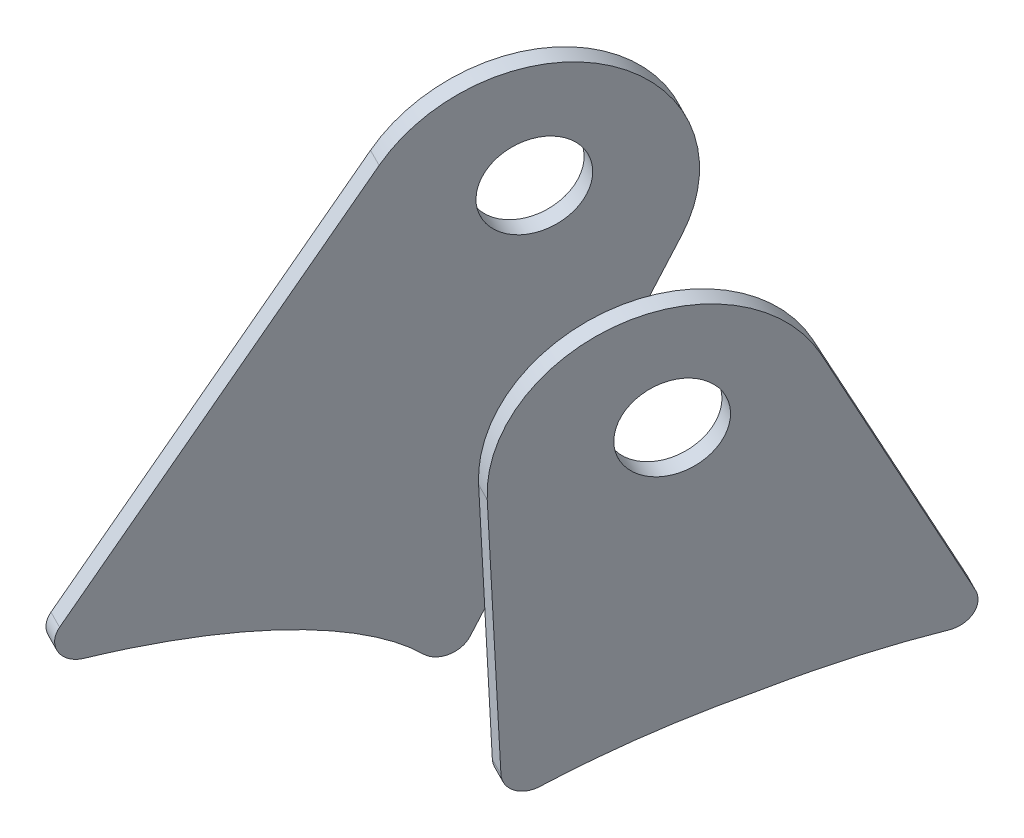
ISO-10303-21;
HEADER;
FILE_DESCRIPTION(('STEP AP214'),'2;1');
FILE_NAME('part.step','',(''),(''),'','','');
FILE_SCHEMA(('AUTOMOTIVE_DESIGN { 1 0 10303 214 1 1 1 1 }'));
ENDSEC;
DATA;
#1=APPLICATION_CONTEXT('core data for automotive mechanical design processes');
#2=APPLICATION_PROTOCOL_DEFINITION('international standard','automotive_design',2000,#1);
#3=PRODUCT_CONTEXT('',#1,'mechanical');
#4=PRODUCT('Part','Part','',(#3));
#5=PRODUCT_RELATED_PRODUCT_CATEGORY('part','',(#4));
#6=PRODUCT_DEFINITION_FORMATION('','',#4);
#7=PRODUCT_DEFINITION_CONTEXT('part definition',#1,'design');
#8=PRODUCT_DEFINITION('design','',#6,#7);
#9=PRODUCT_DEFINITION_SHAPE('','',#8);
#10=(LENGTH_UNIT() NAMED_UNIT(*) SI_UNIT(.MILLI.,.METRE.));
#11=(NAMED_UNIT(*) PLANE_ANGLE_UNIT() SI_UNIT($,.RADIAN.));
#12=(NAMED_UNIT(*) SI_UNIT($,.STERADIAN.) SOLID_ANGLE_UNIT());
#13=UNCERTAINTY_MEASURE_WITH_UNIT(LENGTH_MEASURE(1.E-05),#10,'distance_accuracy_value','');
#14=(GEOMETRIC_REPRESENTATION_CONTEXT(3) GLOBAL_UNCERTAINTY_ASSIGNED_CONTEXT((#13)) GLOBAL_UNIT_ASSIGNED_CONTEXT((#10,
#11,#12)) REPRESENTATION_CONTEXT('',''));
#15=CARTESIAN_POINT('',(0.,0.,0.));
#16=DIRECTION('',(0.,0.,1.));
#17=DIRECTION('',(1.,0.,0.));
#18=AXIS2_PLACEMENT_3D('',#15,#16,#17);
#19=CARTESIAN_POINT('',(1315.91198853962,177.013000299117,496.611994585862));
#20=DIRECTION('',(-0.31307025087173,0.530600499071286,0.787686567363196));
#21=DIRECTION('',(0.,0.829379498727392,-0.558685642459782));
#22=AXIS2_PLACEMENT_3D('',#19,#20,#21);
#23=PLANE('',#22);
#24=DIRECTION('',(0.286551754259209,0.843500847863434,-0.454306517435792));
#25=VECTOR('',#24,1.);
#26=CARTESIAN_POINT('',(1317.06193487105,176.906976746498,497.140466383718));
#27=LINE('',#26,#25);
#28=CARTESIAN_POINT('',(1322.78996053934,193.768135109614,488.059107241894));
#29=VERTEX_POINT('',#28);
#30=CARTESIAN_POINT('',(1331.70769155631,220.01858921439,473.920707244246));
#31=VERTEX_POINT('',#30);
#32=EDGE_CURVE('E114',#29,#31,#27,.T.);
#33=ORIENTED_EDGE('',*,*,#32,.T.);
#34=DIRECTION('',(0.905469552304262,-0.0834831122980549,0.416119525870812));
#35=VECTOR('',#34,1.);
#36=CARTESIAN_POINT('',(1330.55774522488,220.124612767009,473.39223544639));
#37=LINE('',#36,#35);
#38=CARTESIAN_POINT('',(1330.55774522488,220.124612767009,473.39223544639));
#39=VERTEX_POINT('',#38);
#40=EDGE_CURVE('E122',#39,#31,#37,.T.);
#41=ORIENTED_EDGE('',*,*,#40,.F.);
#42=DIRECTION('',(0.286551754259209,0.843500847863434,-0.454306517435792));
#43=VECTOR('',#42,1.);
#44=CARTESIAN_POINT('',(1315.91198853962,177.013000299117,496.611994585862));
#45=LINE('',#44,#43);
#46=CARTESIAN_POINT('',(1321.64001420792,193.874158662233,487.530635444039));
#47=VERTEX_POINT('',#46);
#48=EDGE_CURVE('E110',#47,#39,#45,.T.);
#49=ORIENTED_EDGE('',*,*,#48,.F.);
#50=DIRECTION('',(-0.905469552304262,0.083483112298055,-0.416119525870812));
#51=VECTOR('',#50,1.);
#52=CARTESIAN_POINT('',(1321.64001420792,193.874158662233,487.530635444039));
#53=LINE('',#52,#51);
#54=EDGE_CURVE('E136',#29,#47,#53,.T.);
#55=ORIENTED_EDGE('',*,*,#54,.F.);
#56=EDGE_LOOP('',(#33,#41,#49,#55));
#57=FACE_BOUND('',#56,.T.);
#58=ADVANCED_FACE('F49',(#57),#23,.T.);
#59=CARTESIAN_POINT('',(1329.38625114849,183.005525752072,468.49444871424));
#60=DIRECTION('',(0.349198147405529,-0.410707466315973,-0.842247013031723));
#61=DIRECTION('',(0.,-0.898829300013332,0.438298858585719));
#62=AXIS2_PLACEMENT_3D('',#59,#60,#61);
#63=PLANE('',#62);
#64=DIRECTION('',(-0.241216798126639,-0.907937193352791,0.342730957499012));
#65=VECTOR('',#64,1.);
#66=CARTESIAN_POINT('',(1329.38625114849,183.005525752072,468.49444871424));
#67=LINE('',#66,#65);
#68=CARTESIAN_POINT('',(1336.86585171847,211.158654396695,457.867118093128));
#69=VERTEX_POINT('',#68);
#70=CARTESIAN_POINT('',(1330.55591561826,187.408129070302,466.832540311553));
#71=VERTEX_POINT('',#70);
#72=EDGE_CURVE('E108',#69,#71,#67,.T.);
#73=ORIENTED_EDGE('',*,*,#72,.F.);
#74=DIRECTION('',(0.905469552304262,-0.0834831122980549,0.416119525870812));
#75=VECTOR('',#74,1.);
#76=CARTESIAN_POINT('',(1336.86585171847,211.158654396695,457.867118093128));
#77=LINE('',#76,#75);
#78=CARTESIAN_POINT('',(1338.0157980499,211.052630844077,458.395589890984));
#79=VERTEX_POINT('',#78);
#80=EDGE_CURVE('E117',#69,#79,#77,.T.);
#81=ORIENTED_EDGE('',*,*,#80,.T.);
#82=DIRECTION('',(-0.241216798126639,-0.907937193352791,0.342730957499012));
#83=VECTOR('',#82,1.);
#84=CARTESIAN_POINT('',(1330.53619747992,182.899502199454,469.022920512096));
#85=LINE('',#84,#83);
#86=CARTESIAN_POINT('',(1331.70586194969,187.302105517683,467.361012109409));
#87=VERTEX_POINT('',#86);
#88=EDGE_CURVE('E131',#79,#87,#85,.T.);
#89=ORIENTED_EDGE('',*,*,#88,.T.);
#90=DIRECTION('',(-0.905469552304262,0.083483112298055,-0.416119525870812));
#91=VECTOR('',#90,1.);
#92=CARTESIAN_POINT('',(1330.55591561826,187.408129070302,466.832540311553));
#93=LINE('',#92,#91);
#94=EDGE_CURVE('E12',#71,#87,#93,.F.);
#95=ORIENTED_EDGE('',*,*,#94,.F.);
#96=EDGE_LOOP('',(#73,#81,#89,#95));
#97=FACE_BOUND('',#96,.T.);
#98=ADVANCED_FACE('F125',(#97),#63,.T.);
#99=CARTESIAN_POINT('',(1333.53973936443,215.070643013355,465.889520892256));
#100=DIRECTION('',(-0.905469552304262,0.083483112298055,-0.416119525870812));
#101=DIRECTION('',(0.417577207681798,0.,-0.908641445029156));
#102=AXIS2_PLACEMENT_3D('',#99,#100,#101);
#103=PLANE('',#102);
#104=CARTESIAN_POINT('',(1333.86054144698,216.573994912941,465.493067439949));
#105=DIRECTION('',(-0.905469552304262,0.083483112298055,-0.416119525870812));
#106=DIRECTION('',(-0.417577207681798,0.,0.908641445029156));
#107=AXIS2_PLACEMENT_3D('',#104,#105,#106);
#108=CIRCLE('',#107,3.1750000000001);
#109=CARTESIAN_POINT('',(1332.53473381259,216.573994912941,468.378004027917));
#110=VERTEX_POINT('',#109);
#111=EDGE_CURVE('E132',#110,#110,#108,.T.);
#112=ORIENTED_EDGE('',*,*,#111,.F.);
#113=EDGE_LOOP('',(#112));
#114=FACE_BOUND('',#113,.T.);
#115=ORIENTED_EDGE('',*,*,#48,.T.);
#116=CARTESIAN_POINT('',(1333.53973936443,215.070643013355,465.889520892256));
#117=DIRECTION('',(-0.905469552304262,0.083483112298055,-0.416119525870812));
#118=DIRECTION('',(0.417577207681798,0.,-0.908641445029156));
#119=AXIS2_PLACEMENT_3D('',#116,#117,#118);
#120=CIRCLE('',#119,9.52500000000001);
#121=EDGE_CURVE('E103',#39,#69,#120,.T.);
#122=ORIENTED_EDGE('',*,*,#121,.T.);
#123=ORIENTED_EDGE('',*,*,#72,.T.);
#124=CARTESIAN_POINT('',(1330.00156355926,188.060127173078,468.169607444741));
#125=DIRECTION('',(0.905469552304262,-0.083483112298055,0.416119525870812));
#126=DIRECTION('',(0.417577207681798,0.,-0.908641445029156));
#127=AXIS2_PLACEMENT_3D('',#124,#125,#126);
#128=CIRCLE('',#127,1.5875);
#129=CARTESIAN_POINT('',(1329.46211870526,186.901216929926,469.110927022683));
#130=VERTEX_POINT('',#129);
#131=EDGE_CURVE('E140',#130,#71,#128,.T.);
#132=ORIENTED_EDGE('',*,*,#131,.F.);
#133=CARTESIAN_POINT('',(1317.99053268235,177.937409229088,492.274572793221));
#134=DIRECTION('',(0.905469552304262,-0.083483112298055,0.416119525870812));
#135=DIRECTION('',(-0.424386223901574,-0.188740959148202,0.885591995956591));
#136=AXIS2_PLACEMENT_3D('',#133,#134,#135);
#137=ELLIPSE('',#136,28.4779023788006,12.7);
#138=CARTESIAN_POINT('',(1322.03720766495,191.450632950807,486.18013392729));
#139=VERTEX_POINT('',#138);
#140=EDGE_CURVE('E194',#130,#139,#137,.T.);
#141=ORIENTED_EDGE('',*,*,#140,.T.);
#142=CARTESIAN_POINT('',(1322.13701323118,193.031830369957,486.280183018349));
#143=DIRECTION('',(0.905469552304262,-0.083483112298055,0.416119525870812));
#144=DIRECTION('',(0.417577207681798,0.,-0.908641445029156));
#145=AXIS2_PLACEMENT_3D('',#142,#143,#144);
#146=CIRCLE('',#145,1.5875);
#147=EDGE_CURVE('E142',#47,#139,#146,.T.);
#148=ORIENTED_EDGE('',*,*,#147,.F.);
#149=EDGE_LOOP('',(#115,#122,#123,#132,#141,#148));
#150=FACE_BOUND('',#149,.T.);
#151=ADVANCED_FACE('F105',(#114,#150),#103,.T.);
#152=CARTESIAN_POINT('',(1334.68968569586,214.964619460736,466.417992690112));
#153=DIRECTION('',(-0.905469552304262,0.083483112298055,-0.416119525870812));
#154=DIRECTION('',(0.417577207681798,0.,-0.908641445029156));
#155=AXIS2_PLACEMENT_3D('',#152,#153,#154);
#156=PLANE('',#155);
#157=CARTESIAN_POINT('',(1335.0104877784,216.467971360322,466.021539237805));
#158=DIRECTION('',(-0.905469552304262,0.083483112298055,-0.416119525870812));
#159=DIRECTION('',(-0.417577207681798,0.,0.908641445029156));
#160=AXIS2_PLACEMENT_3D('',#157,#158,#159);
#161=CIRCLE('',#160,3.1750000000001);
#162=CARTESIAN_POINT('',(1333.68468014401,216.467971360322,468.906475825773));
#163=VERTEX_POINT('',#162);
#164=EDGE_CURVE('E193',#163,#163,#161,.T.);
#165=ORIENTED_EDGE('',*,*,#164,.T.);
#166=EDGE_LOOP('',(#165));
#167=FACE_BOUND('',#166,.T.);
#168=CARTESIAN_POINT('',(1319.14047901378,177.83138567647,492.803044591077));
#169=DIRECTION('',(0.905469552304262,-0.083483112298055,0.416119525870812));
#170=DIRECTION('',(-0.424386223901574,-0.188740959148202,0.885591995956591));
#171=AXIS2_PLACEMENT_3D('',#168,#169,#170);
#172=ELLIPSE('',#171,28.4779023788006,12.7);
#173=CARTESIAN_POINT('',(1330.61206503669,186.795193377308,469.639398820539));
#174=VERTEX_POINT('',#173);
#175=CARTESIAN_POINT('',(1323.18715399637,191.344609398188,486.708605725146));
#176=VERTEX_POINT('',#175);
#177=EDGE_CURVE('E153',#174,#176,#172,.T.);
#178=ORIENTED_EDGE('',*,*,#177,.F.);
#179=CARTESIAN_POINT('',(1331.15150989068,187.95410362046,468.698079242597));
#180=DIRECTION('',(0.905469552304262,-0.083483112298055,0.416119525870812));
#181=DIRECTION('',(0.417577207681798,0.,-0.908641445029156));
#182=AXIS2_PLACEMENT_3D('',#179,#180,#181);
#183=CIRCLE('',#182,1.5875);
#184=EDGE_CURVE('E64',#87,#174,#183,.F.);
#185=ORIENTED_EDGE('',*,*,#184,.F.);
#186=ORIENTED_EDGE('',*,*,#88,.F.);
#187=CARTESIAN_POINT('',(1334.68968569586,214.964619460736,466.417992690112));
#188=DIRECTION('',(-0.905469552304262,0.083483112298055,-0.416119525870812));
#189=DIRECTION('',(0.417577207681798,0.,-0.908641445029156));
#190=AXIS2_PLACEMENT_3D('',#187,#188,#189);
#191=CIRCLE('',#190,9.52500000000001);
#192=EDGE_CURVE('E119',#31,#79,#191,.T.);
#193=ORIENTED_EDGE('',*,*,#192,.F.);
#194=ORIENTED_EDGE('',*,*,#32,.F.);
#195=CARTESIAN_POINT('',(1323.2869595626,192.925806817338,486.808654816205));
#196=DIRECTION('',(0.905469552304262,-0.083483112298055,0.416119525870812));
#197=DIRECTION('',(0.417577207681798,0.,-0.908641445029156));
#198=AXIS2_PLACEMENT_3D('',#195,#196,#197);
#199=CIRCLE('',#198,1.5875);
#200=EDGE_CURVE('E57',#176,#29,#199,.F.);
#201=ORIENTED_EDGE('',*,*,#200,.F.);
#202=EDGE_LOOP('',(#178,#185,#186,#193,#194,#201));
#203=FACE_BOUND('',#202,.T.);
#204=ADVANCED_FACE('F152',(#167,#203),#156,.F.);
#205=CARTESIAN_POINT('',(1333.53973936443,215.070643013355,465.889520892256));
#206=DIRECTION('',(0.905469552304262,-0.0834831122980549,0.416119525870812));
#207=DIRECTION('',(-0.417577207681798,0.,0.908641445029156));
#208=AXIS2_PLACEMENT_3D('',#205,#206,#207);
#209=CYLINDRICAL_SURFACE('',#208,9.52500000000001);
#210=ORIENTED_EDGE('',*,*,#192,.T.);
#211=ORIENTED_EDGE('',*,*,#80,.F.);
#212=ORIENTED_EDGE('',*,*,#121,.F.);
#213=ORIENTED_EDGE('',*,*,#40,.T.);
#214=EDGE_LOOP('',(#210,#211,#212,#213));
#215=FACE_BOUND('',#214,.T.);
#216=ADVANCED_FACE('F118',(#215),#209,.T.);
#217=CARTESIAN_POINT('',(1333.86054144698,216.573994912941,465.493067439949));
#218=DIRECTION('',(0.905469552304262,-0.0834831122980549,0.416119525870812));
#219=DIRECTION('',(-0.417577207681798,0.,0.908641445029156));
#220=AXIS2_PLACEMENT_3D('',#217,#218,#219);
#221=CYLINDRICAL_SURFACE('',#220,3.1750000000001);
#222=ORIENTED_EDGE('',*,*,#111,.T.);
#223=EDGE_LOOP('',(#222));
#224=FACE_BOUND('',#223,.T.);
#225=ORIENTED_EDGE('',*,*,#164,.F.);
#226=EDGE_LOOP('',(#225));
#227=FACE_BOUND('',#226,.T.);
#228=ADVANCED_FACE('F161',(#224,#227),#221,.F.);
#229=CARTESIAN_POINT('',(1319.14047901378,177.83138567647,492.803044591077));
#230=DIRECTION('',(0.905469552304262,-0.083483112298055,0.416119525870812));
#231=DIRECTION('',(-0.424386223901574,-0.188740959148202,0.885591995956591));
#232=AXIS2_PLACEMENT_3D('',#229,#230,#231);
#233=ELLIPSE('',#232,28.4779023788006,12.7);
#234=DIRECTION('',(-0.905469552304262,0.083483112298055,-0.416119525870812));
#235=VECTOR('',#234,1.);
#236=SURFACE_OF_LINEAR_EXTRUSION('',#233,#235);
#237=ORIENTED_EDGE('',*,*,#140,.F.);
#238=DIRECTION('',(-0.905469552304262,0.083483112298055,-0.416119525870812));
#239=VECTOR('',#238,1.);
#240=CARTESIAN_POINT('',(1330.61206503669,186.795193377308,469.639398820539));
#241=LINE('',#240,#239);
#242=EDGE_CURVE('E144',#174,#130,#241,.T.);
#243=ORIENTED_EDGE('',*,*,#242,.F.);
#244=ORIENTED_EDGE('',*,*,#177,.T.);
#245=DIRECTION('',(-0.905469552304262,0.083483112298055,-0.416119525870812));
#246=VECTOR('',#245,1.);
#247=CARTESIAN_POINT('',(1322.03720766495,191.450632950807,486.18013392729));
#248=LINE('',#247,#246);
#249=EDGE_CURVE('E71',#139,#176,#248,.F.);
#250=ORIENTED_EDGE('',*,*,#249,.F.);
#251=EDGE_LOOP('',(#237,#243,#244,#250));
#252=FACE_BOUND('',#251,.T.);
#253=ADVANCED_FACE('F173',(#252),#236,.T.);
#254=CARTESIAN_POINT('',(1322.71198639689,192.978818593648,486.544418917277));
#255=DIRECTION('',(-0.905469552304262,0.083483112298055,-0.416119525870812));
#256=DIRECTION('',(0.417577207681798,0.,-0.908641445029156));
#257=AXIS2_PLACEMENT_3D('',#254,#255,#256);
#258=CYLINDRICAL_SURFACE('',#257,1.5875);
#259=ORIENTED_EDGE('',*,*,#200,.T.);
#260=ORIENTED_EDGE('',*,*,#54,.T.);
#261=ORIENTED_EDGE('',*,*,#147,.T.);
#262=ORIENTED_EDGE('',*,*,#249,.T.);
#263=EDGE_LOOP('',(#259,#260,#261,#262));
#264=FACE_BOUND('',#263,.T.);
#265=ADVANCED_FACE('F148',(#264),#258,.T.);
#266=CARTESIAN_POINT('',(1330.57653672497,188.007115396769,468.433843343669));
#267=DIRECTION('',(-0.905469552304262,0.083483112298055,-0.416119525870812));
#268=DIRECTION('',(0.417577207681798,0.,-0.908641445029156));
#269=AXIS2_PLACEMENT_3D('',#266,#267,#268);
#270=CYLINDRICAL_SURFACE('',#269,1.5875);
#271=ORIENTED_EDGE('',*,*,#184,.T.);
#272=ORIENTED_EDGE('',*,*,#242,.T.);
#273=ORIENTED_EDGE('',*,*,#131,.T.);
#274=ORIENTED_EDGE('',*,*,#94,.T.);
#275=EDGE_LOOP('',(#271,#272,#273,#274));
#276=FACE_BOUND('',#275,.T.);
#277=ADVANCED_FACE('F51',(#276),#270,.T.);
#278=CLOSED_SHELL('',(#58,#98,#151,#204,#216,#228,#253,#265,#277));
#279=MANIFOLD_SOLID_BREP('B2',#278);
#280=CARTESIAN_POINT('',(1349.07018245253,212.595197620884,483.483020617896));
#281=DIRECTION('',(0.421904939227984,0.0706608921737899,-0.90388232672856));
#282=DIRECTION('',(0.906147337010236,0.,0.422962177539857));
#283=AXIS2_PLACEMENT_3D('',#280,#281,#282);
#284=PLANE('',#283);
#285=DIRECTION('',(0.0460555328375425,0.994000808992746,0.0992032238226956));
#286=VECTOR('',#285,1.);
#287=CARTESIAN_POINT('',(1349.07018245253,212.595197620884,483.483020617896));
#288=LINE('',#287,#286);
#289=CARTESIAN_POINT('',(1348.21184254041,194.069940947574,481.634163788496));
#290=VERTEX_POINT('',#289);
#291=CARTESIAN_POINT('',(1349.07018245253,212.595197620884,483.483020617896));
#292=VERTEX_POINT('',#291);
#293=EDGE_CURVE('E395',#290,#292,#288,.T.);
#294=ORIENTED_EDGE('',*,*,#293,.T.);
#295=DIRECTION('',(-0.905469552304262,0.0834831122980549,-0.416119525870812));
#296=VECTOR('',#295,1.);
#297=CARTESIAN_POINT('',(1349.07018245253,212.595197620884,483.483020617896));
#298=LINE('',#297,#296);
#299=CARTESIAN_POINT('',(1347.92023612111,212.701221173503,482.95454882004));
#300=VERTEX_POINT('',#299);
#301=EDGE_CURVE('E403',#292,#300,#298,.T.);
#302=ORIENTED_EDGE('',*,*,#301,.T.);
#303=DIRECTION('',(0.0460555328375425,0.994000808992746,0.0992032238226956));
#304=VECTOR('',#303,1.);
#305=CARTESIAN_POINT('',(1347.92023612111,212.701221173503,482.95454882004));
#306=LINE('',#305,#304);
#307=CARTESIAN_POINT('',(1347.06189620898,194.175964500192,481.10569199064));
#308=VERTEX_POINT('',#307);
#309=EDGE_CURVE('E414',#308,#300,#306,.T.);
#310=ORIENTED_EDGE('',*,*,#309,.F.);
#311=DIRECTION('',(0.905469552304262,-0.0834831122980549,0.416119525870812));
#312=VECTOR('',#311,1.);
#313=CARTESIAN_POINT('',(1347.06189620898,194.175964500192,481.10569199064));
#314=LINE('',#313,#312);
#315=EDGE_CURVE('E47',#290,#308,#314,.F.);
#316=ORIENTED_EDGE('',*,*,#315,.F.);
#317=EDGE_LOOP('',(#294,#302,#310,#316));
#318=FACE_BOUND('',#317,.T.);
#319=ADVANCED_FACE('F262',(#318),#284,.F.);
#320=CARTESIAN_POINT('',(1361.06217513073,186.596398265217,452.172677993332));
#321=DIRECTION('',(-0.407647260300071,-0.443914751090842,0.797974564089484));
#322=DIRECTION('',(0.,0.873880257042931,0.486141230868748));
#323=AXIS2_PLACEMENT_3D('',#320,#321,#322);
#324=PLANE('',#323);
#325=DIRECTION('',(0.118104195606108,-0.892171655974895,-0.435982952941108));
#326=VECTOR('',#325,1.);
#327=CARTESIAN_POINT('',(1359.9122287993,186.702421817836,451.644206195476));
#328=LINE('',#327,#326);
#329=CARTESIAN_POINT('',(1355.82172082161,217.602554175599,466.744361934998));
#330=VERTEX_POINT('',#329);
#331=CARTESIAN_POINT('',(1358.19017999836,199.710961629034,458.00116851585));
#332=VERTEX_POINT('',#331);
#333=EDGE_CURVE('E410',#330,#332,#328,.T.);
#334=ORIENTED_EDGE('',*,*,#333,.F.);
#335=DIRECTION('',(-0.905469552304262,0.0834831122980549,-0.416119525870812));
#336=VECTOR('',#335,1.);
#337=CARTESIAN_POINT('',(1356.97166715304,217.49653062298,467.272833732854));
#338=LINE('',#337,#336);
#339=CARTESIAN_POINT('',(1356.97166715304,217.49653062298,467.272833732854));
#340=VERTEX_POINT('',#339);
#341=EDGE_CURVE('E406',#340,#330,#338,.T.);
#342=ORIENTED_EDGE('',*,*,#341,.F.);
#343=DIRECTION('',(0.118104195606108,-0.892171655974895,-0.435982952941108));
#344=VECTOR('',#343,1.);
#345=CARTESIAN_POINT('',(1361.06217513073,186.596398265217,452.172677993332));
#346=LINE('',#345,#344);
#347=CARTESIAN_POINT('',(1359.34012632978,199.604938076416,458.529640313706));
#348=VERTEX_POINT('',#347);
#349=EDGE_CURVE('E409',#340,#348,#346,.T.);
#350=ORIENTED_EDGE('',*,*,#349,.T.);
#351=DIRECTION('',(0.905469552304262,-0.0834831122980549,0.416119525870812));
#352=VECTOR('',#351,1.);
#353=CARTESIAN_POINT('',(1359.34012632978,199.604938076416,458.529640313706));
#354=LINE('',#353,#352);
#355=EDGE_CURVE('E386',#332,#348,#354,.T.);
#356=ORIENTED_EDGE('',*,*,#355,.F.);
#357=EDGE_LOOP('',(#334,#342,#350,#356));
#358=FACE_BOUND('',#357,.T.);
#359=ADVANCED_FACE('F362',(#358),#324,.F.);
#360=CARTESIAN_POINT('',(1353.08882699868,213.26824261884,474.873541455806));
#361=DIRECTION('',(-0.905469552304262,0.083483112298055,-0.416119525870812));
#362=DIRECTION('',(0.417577207681798,0.,-0.908641445029156));
#363=AXIS2_PLACEMENT_3D('',#360,#361,#362);
#364=PLANE('',#363);
#365=ORIENTED_EDGE('',*,*,#349,.F.);
#366=CARTESIAN_POINT('',(1353.08882699868,213.26824261884,474.873541455806));
#367=DIRECTION('',(-0.905469552304262,0.083483112298055,-0.416119525870812));
#368=DIRECTION('',(0.417577207681798,0.,-0.908641445029156));
#369=AXIS2_PLACEMENT_3D('',#366,#367,#368);
#370=CIRCLE('',#369,9.52500000000002);
#371=EDGE_CURVE('E418',#292,#340,#370,.T.);
#372=ORIENTED_EDGE('',*,*,#371,.F.);
#373=ORIENTED_EDGE('',*,*,#293,.F.);
#374=CARTESIAN_POINT('',(1348.88161663144,194.1821151139,480.199250594814));
#375=DIRECTION('',(0.905469552304262,-0.083483112298055,0.416119525870812));
#376=DIRECTION('',(0.417577207681798,0.,-0.908641445029156));
#377=AXIS2_PLACEMENT_3D('',#374,#375,#376);
#378=CIRCLE('',#377,1.5875);
#379=CARTESIAN_POINT('',(1349.01338709623,192.710987222612,479.617378167143));
#380=VERTEX_POINT('',#379);
#381=EDGE_CURVE('E276',#380,#290,#378,.F.);
#382=ORIENTED_EDGE('',*,*,#381,.F.);
#383=CARTESIAN_POINT('',(1353.76553839419,183.351301844438,467.399004220128));
#384=DIRECTION('',(0.905469552304262,-0.083483112298055,0.416119525870812));
#385=DIRECTION('',(-0.424386223901574,-0.188740959148202,0.885591995956591));
#386=AXIS2_PLACEMENT_3D('',#383,#384,#385);
#387=ELLIPSE('',#386,28.4779023788006,12.7);
#388=CARTESIAN_POINT('',(1354.24795430374,196.005988895019,468.888094983656));
#389=VERTEX_POINT('',#388);
#390=EDGE_CURVE('E328',#389,#380,#387,.T.);
#391=ORIENTED_EDGE('',*,*,#390,.F.);
#392=CARTESIAN_POINT('',(1354.84726626603,183.832388045096,465.141698277685));
#393=DIRECTION('',(0.905469552304262,-0.083483112298055,0.416119525870812));
#394=DIRECTION('',(-0.424386223901574,-0.188740959148202,0.885591995956591));
#395=AXIS2_PLACEMENT_3D('',#392,#393,#394);
#396=ELLIPSE('',#395,28.4779023788006,12.7);
#397=CARTESIAN_POINT('',(1358.60149910664,197.319760881468,459.678422639344));
#398=VERTEX_POINT('',#397);
#399=EDGE_CURVE('E325',#398,#389,#396,.T.);
#400=ORIENTED_EDGE('',*,*,#399,.F.);
#401=CARTESIAN_POINT('',(1358.69298630406,198.900223409059,459.796424934198));
#402=DIRECTION('',(0.905469552304262,-0.083483112298055,0.416119525870812));
#403=DIRECTION('',(0.417577207681798,0.,-0.908641445029156));
#404=AXIS2_PLACEMENT_3D('',#401,#402,#403);
#405=CIRCLE('',#404,1.5875);
#406=EDGE_CURVE('E383',#348,#398,#405,.F.);
#407=ORIENTED_EDGE('',*,*,#406,.F.);
#408=EDGE_LOOP('',(#365,#372,#373,#382,#391,#400,#407));
#409=FACE_BOUND('',#408,.T.);
#410=CARTESIAN_POINT('',(1353.40962908123,214.771594518426,474.4770880035));
#411=DIRECTION('',(-0.905469552304262,0.083483112298055,-0.416119525870812));
#412=DIRECTION('',(-0.417577207681798,0.,0.908641445029156));
#413=AXIS2_PLACEMENT_3D('',#410,#411,#412);
#414=CIRCLE('',#413,3.1750000000001);
#415=CARTESIAN_POINT('',(1352.08382144684,214.771594518426,477.362024591468));
#416=VERTEX_POINT('',#415);
#417=EDGE_CURVE('E343',#416,#416,#414,.T.);
#418=ORIENTED_EDGE('',*,*,#417,.T.);
#419=EDGE_LOOP('',(#418));
#420=FACE_BOUND('',#419,.T.);
#421=ADVANCED_FACE('F359',(#409,#420),#364,.F.);
#422=CARTESIAN_POINT('',(1351.93888066725,213.374266171458,474.345069657951));
#423=DIRECTION('',(-0.905469552304262,0.083483112298055,-0.416119525870812));
#424=DIRECTION('',(0.417577207681798,0.,-0.908641445029156));
#425=AXIS2_PLACEMENT_3D('',#422,#423,#424);
#426=PLANE('',#425);
#427=CARTESIAN_POINT('',(1353.6973199346,183.938411597715,464.613226479829));
#428=DIRECTION('',(0.905469552304262,-0.083483112298055,0.416119525870812));
#429=DIRECTION('',(-0.424386223901574,-0.188740959148202,0.885591995956591));
#430=AXIS2_PLACEMENT_3D('',#427,#428,#429);
#431=ELLIPSE('',#430,28.4779023788006,12.7);
#432=CARTESIAN_POINT('',(1357.45155277521,197.425784434087,459.149950841488));
#433=VERTEX_POINT('',#432);
#434=CARTESIAN_POINT('',(1353.09800797231,196.112012447637,468.3596231858));
#435=VERTEX_POINT('',#434);
#436=EDGE_CURVE('E323',#433,#435,#431,.T.);
#437=ORIENTED_EDGE('',*,*,#436,.T.);
#438=CARTESIAN_POINT('',(1352.61559206276,183.457325397057,466.870532422272));
#439=DIRECTION('',(0.905469552304262,-0.083483112298055,0.416119525870812));
#440=DIRECTION('',(-0.424386223901574,-0.188740959148202,0.885591995956591));
#441=AXIS2_PLACEMENT_3D('',#438,#439,#440);
#442=ELLIPSE('',#441,28.4779023788006,12.7);
#443=CARTESIAN_POINT('',(1347.86344076481,192.817010775231,479.088906369288));
#444=VERTEX_POINT('',#443);
#445=EDGE_CURVE('E331',#435,#444,#442,.T.);
#446=ORIENTED_EDGE('',*,*,#445,.T.);
#447=CARTESIAN_POINT('',(1347.73167030001,194.288138666518,479.670778796959));
#448=DIRECTION('',(0.905469552304262,-0.083483112298055,0.416119525870812));
#449=DIRECTION('',(0.417577207681798,0.,-0.908641445029156));
#450=AXIS2_PLACEMENT_3D('',#447,#448,#449);
#451=CIRCLE('',#450,1.5875);
#452=EDGE_CURVE('E400',#308,#444,#451,.T.);
#453=ORIENTED_EDGE('',*,*,#452,.F.);
#454=ORIENTED_EDGE('',*,*,#309,.T.);
#455=CARTESIAN_POINT('',(1351.93888066725,213.374266171458,474.345069657951));
#456=DIRECTION('',(-0.905469552304262,0.083483112298055,-0.416119525870812));
#457=DIRECTION('',(0.417577207681798,0.,-0.908641445029156));
#458=AXIS2_PLACEMENT_3D('',#455,#456,#457);
#459=CIRCLE('',#458,9.52500000000002);
#460=EDGE_CURVE('E412',#300,#330,#459,.T.);
#461=ORIENTED_EDGE('',*,*,#460,.T.);
#462=ORIENTED_EDGE('',*,*,#333,.T.);
#463=CARTESIAN_POINT('',(1357.54303997263,199.006246961677,459.267953136342));
#464=DIRECTION('',(0.905469552304262,-0.083483112298055,0.416119525870812));
#465=DIRECTION('',(0.417577207681798,0.,-0.908641445029156));
#466=AXIS2_PLACEMENT_3D('',#463,#464,#465);
#467=CIRCLE('',#466,1.5875);
#468=EDGE_CURVE('E339',#433,#332,#467,.T.);
#469=ORIENTED_EDGE('',*,*,#468,.F.);
#470=EDGE_LOOP('',(#437,#446,#453,#454,#461,#462,#469));
#471=FACE_BOUND('',#470,.T.);
#472=CARTESIAN_POINT('',(1352.2596827498,214.877618071044,473.948616205644));
#473=DIRECTION('',(-0.905469552304262,0.083483112298055,-0.416119525870812));
#474=DIRECTION('',(-0.417577207681798,0.,0.908641445029156));
#475=AXIS2_PLACEMENT_3D('',#472,#473,#474);
#476=CIRCLE('',#475,3.1750000000001);
#477=CARTESIAN_POINT('',(1350.93387511541,214.877618071044,476.833552793612));
#478=VERTEX_POINT('',#477);
#479=EDGE_CURVE('E340',#478,#478,#476,.T.);
#480=ORIENTED_EDGE('',*,*,#479,.F.);
#481=EDGE_LOOP('',(#480));
#482=FACE_BOUND('',#481,.T.);
#483=ADVANCED_FACE('F336',(#471,#482),#426,.T.);
#484=CARTESIAN_POINT('',(1353.08882699868,213.26824261884,474.873541455806));
#485=DIRECTION('',(-0.905469552304262,0.0834831122980549,-0.416119525870812));
#486=DIRECTION('',(0.417577207681798,0.,-0.908641445029156));
#487=AXIS2_PLACEMENT_3D('',#484,#485,#486);
#488=CYLINDRICAL_SURFACE('',#487,9.52500000000002);
#489=ORIENTED_EDGE('',*,*,#460,.F.);
#490=ORIENTED_EDGE('',*,*,#301,.F.);
#491=ORIENTED_EDGE('',*,*,#371,.T.);
#492=ORIENTED_EDGE('',*,*,#341,.T.);
#493=EDGE_LOOP('',(#489,#490,#491,#492));
#494=FACE_BOUND('',#493,.T.);
#495=ADVANCED_FACE('F357',(#494),#488,.T.);
#496=CARTESIAN_POINT('',(1353.40962908123,214.771594518426,474.4770880035));
#497=DIRECTION('',(-0.905469552304262,0.0834831122980549,-0.416119525870812));
#498=DIRECTION('',(0.417577207681798,0.,-0.908641445029156));
#499=AXIS2_PLACEMENT_3D('',#496,#497,#498);
#500=CYLINDRICAL_SURFACE('',#499,3.1750000000001);
#501=ORIENTED_EDGE('',*,*,#417,.F.);
#502=EDGE_LOOP('',(#501));
#503=FACE_BOUND('',#502,.T.);
#504=ORIENTED_EDGE('',*,*,#479,.T.);
#505=EDGE_LOOP('',(#504));
#506=FACE_BOUND('',#505,.T.);
#507=ADVANCED_FACE('F354',(#503,#506),#500,.F.);
#508=CARTESIAN_POINT('',(1354.84726626603,183.832388045096,465.141698277685));
#509=DIRECTION('',(0.905469552304262,-0.083483112298055,0.416119525870812));
#510=DIRECTION('',(-0.424386223901574,-0.188740959148202,0.885591995956591));
#511=AXIS2_PLACEMENT_3D('',#508,#509,#510);
#512=ELLIPSE('',#511,28.4779023788006,12.7);
#513=DIRECTION('',(-0.905469552304262,0.083483112298055,-0.416119525870812));
#514=VECTOR('',#513,1.);
#515=SURFACE_OF_LINEAR_EXTRUSION('',#512,#514);
#516=ORIENTED_EDGE('',*,*,#399,.T.);
#517=DIRECTION('',(-0.905469552304262,0.083483112298055,-0.416119525870812));
#518=VECTOR('',#517,1.);
#519=CARTESIAN_POINT('',(1353.09800797231,196.112012447636,468.359623185807));
#520=LINE('',#519,#518);
#521=EDGE_CURVE('E319',#435,#389,#520,.F.);
#522=ORIENTED_EDGE('',*,*,#521,.F.);
#523=ORIENTED_EDGE('',*,*,#436,.F.);
#524=DIRECTION('',(-0.905469552304262,0.083483112298055,-0.416119525870812));
#525=VECTOR('',#524,1.);
#526=CARTESIAN_POINT('',(1358.60149910664,197.319760881468,459.678422639344));
#527=LINE('',#526,#525);
#528=EDGE_CURVE('E384',#398,#433,#527,.T.);
#529=ORIENTED_EDGE('',*,*,#528,.F.);
#530=EDGE_LOOP('',(#516,#522,#523,#529));
#531=FACE_BOUND('',#530,.T.);
#532=ADVANCED_FACE('F321',(#531),#515,.T.);
#533=CARTESIAN_POINT('',(1352.61559206276,183.457325397057,466.870532422272));
#534=DIRECTION('',(0.905469552304262,-0.083483112298055,0.416119525870812));
#535=DIRECTION('',(-0.424386223901574,-0.188740959148202,0.885591995956591));
#536=AXIS2_PLACEMENT_3D('',#533,#534,#535);
#537=ELLIPSE('',#536,28.4779023788006,12.7);
#538=DIRECTION('',(-0.905469552304262,0.083483112298055,-0.416119525870812));
#539=VECTOR('',#538,1.);
#540=SURFACE_OF_LINEAR_EXTRUSION('',#537,#539);
#541=ORIENTED_EDGE('',*,*,#445,.F.);
#542=ORIENTED_EDGE('',*,*,#521,.T.);
#543=ORIENTED_EDGE('',*,*,#390,.T.);
#544=DIRECTION('',(-0.905469552304262,0.083483112298055,-0.416119525870812));
#545=VECTOR('',#544,1.);
#546=CARTESIAN_POINT('',(1347.86344076481,192.817010775231,479.088906369288));
#547=LINE('',#546,#545);
#548=EDGE_CURVE('E270',#444,#380,#547,.F.);
#549=ORIENTED_EDGE('',*,*,#548,.F.);
#550=EDGE_LOOP('',(#541,#542,#543,#549));
#551=FACE_BOUND('',#550,.T.);
#552=ADVANCED_FACE('F332',(#551),#540,.T.);
#553=CARTESIAN_POINT('',(1358.11801313834,198.953235185368,459.53218903527));
#554=DIRECTION('',(-0.905469552304262,0.083483112298055,-0.416119525870812));
#555=DIRECTION('',(0.417577207681798,0.,-0.908641445029156));
#556=AXIS2_PLACEMENT_3D('',#553,#554,#555);
#557=CYLINDRICAL_SURFACE('',#556,1.5875);
#558=ORIENTED_EDGE('',*,*,#406,.T.);
#559=ORIENTED_EDGE('',*,*,#528,.T.);
#560=ORIENTED_EDGE('',*,*,#468,.T.);
#561=ORIENTED_EDGE('',*,*,#355,.T.);
#562=EDGE_LOOP('',(#558,#559,#560,#561));
#563=FACE_BOUND('',#562,.T.);
#564=ADVANCED_FACE('F374',(#563),#557,.T.);
#565=CARTESIAN_POINT('',(1348.30664346572,194.235126890209,479.935014695886));
#566=DIRECTION('',(-0.905469552304262,0.083483112298055,-0.416119525870812));
#567=DIRECTION('',(0.417577207681798,0.,-0.908641445029156));
#568=AXIS2_PLACEMENT_3D('',#565,#566,#567);
#569=CYLINDRICAL_SURFACE('',#568,1.5875);
#570=ORIENTED_EDGE('',*,*,#452,.T.);
#571=ORIENTED_EDGE('',*,*,#548,.T.);
#572=ORIENTED_EDGE('',*,*,#381,.T.);
#573=ORIENTED_EDGE('',*,*,#315,.T.);
#574=EDGE_LOOP('',(#570,#571,#572,#573));
#575=FACE_BOUND('',#574,.T.);
#576=ADVANCED_FACE('F264',(#575),#569,.T.);
#577=CLOSED_SHELL('',(#319,#359,#421,#483,#495,#507,#532,#552,#564,#576));
#578=MANIFOLD_SOLID_BREP('B6',#577);
#579=ADVANCED_BREP_SHAPE_REPRESENTATION('',(#18,#279,#578),#14);
#580=SHAPE_DEFINITION_REPRESENTATION(#9,#579);
ENDSEC;
END-ISO-10303-21;
